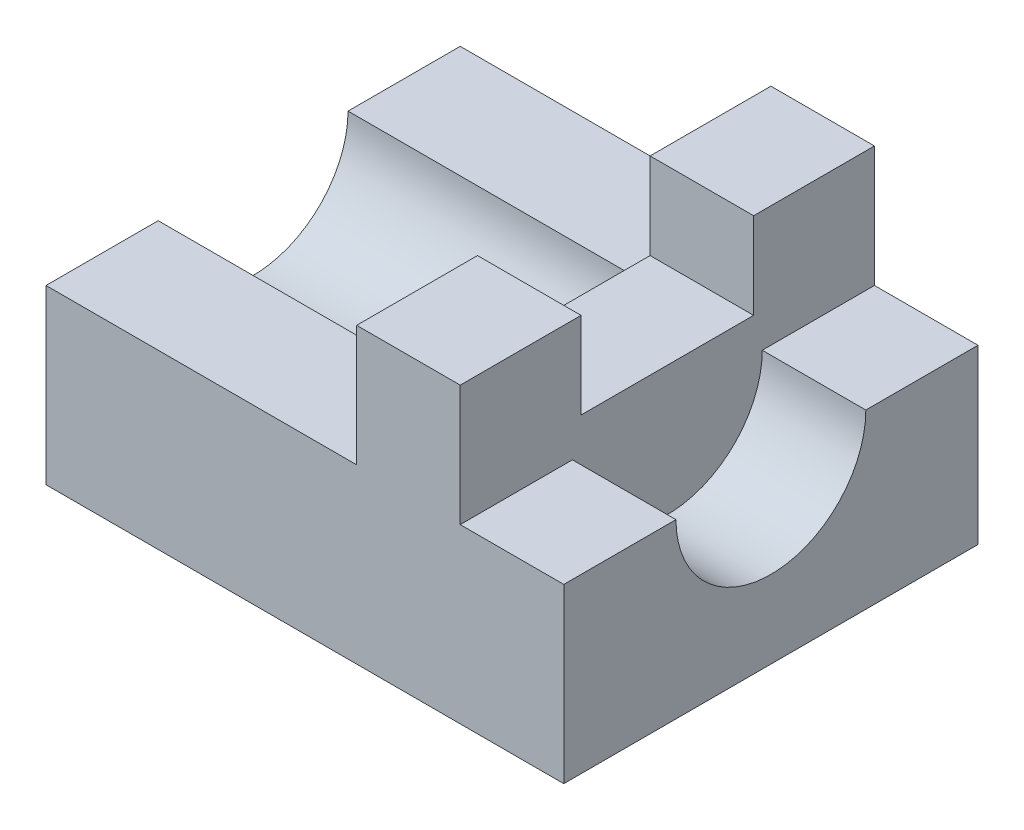
ISO-10303-21;
HEADER;
FILE_DESCRIPTION(('STEP AP214'),'2;1');
FILE_NAME('part.step','',(''),(''),'','','');
FILE_SCHEMA(('AUTOMOTIVE_DESIGN { 1 0 10303 214 1 1 1 1 }'));
ENDSEC;
DATA;
#1=APPLICATION_CONTEXT('core data for automotive mechanical design processes');
#2=APPLICATION_PROTOCOL_DEFINITION('international standard','automotive_design',2000,#1);
#3=PRODUCT_CONTEXT('',#1,'mechanical');
#4=PRODUCT('Part','Part','',(#3));
#5=PRODUCT_RELATED_PRODUCT_CATEGORY('part','',(#4));
#6=PRODUCT_DEFINITION_FORMATION('','',#4);
#7=PRODUCT_DEFINITION_CONTEXT('part definition',#1,'design');
#8=PRODUCT_DEFINITION('design','',#6,#7);
#9=PRODUCT_DEFINITION_SHAPE('','',#8);
#10=(LENGTH_UNIT() NAMED_UNIT(*) SI_UNIT(.MILLI.,.METRE.));
#11=(NAMED_UNIT(*) PLANE_ANGLE_UNIT() SI_UNIT($,.RADIAN.));
#12=(NAMED_UNIT(*) SI_UNIT($,.STERADIAN.) SOLID_ANGLE_UNIT());
#13=UNCERTAINTY_MEASURE_WITH_UNIT(LENGTH_MEASURE(1.E-05),#10,'distance_accuracy_value','');
#14=(GEOMETRIC_REPRESENTATION_CONTEXT(3) GLOBAL_UNCERTAINTY_ASSIGNED_CONTEXT((#13)) GLOBAL_UNIT_ASSIGNED_CONTEXT((#10,
#11,#12)) REPRESENTATION_CONTEXT('',''));
#15=CARTESIAN_POINT('',(0.,0.,0.));
#16=DIRECTION('',(0.,0.,1.));
#17=DIRECTION('',(1.,0.,0.));
#18=AXIS2_PLACEMENT_3D('',#15,#16,#17);
#19=CARTESIAN_POINT('',(75.,25.,0.));
#20=DIRECTION('',(-1.,0.,0.));
#21=DIRECTION('',(0.,0.,1.));
#22=AXIS2_PLACEMENT_3D('',#19,#20,#21);
#23=CYLINDRICAL_SURFACE('',#22,27.5);
#24=DIRECTION('',(-1.,0.,0.));
#25=VECTOR('',#24,1.);
#26=CARTESIAN_POINT('',(75.,25.,27.5));
#27=LINE('',#26,#25);
#28=CARTESIAN_POINT('',(15.,25.,27.5));
#29=VERTEX_POINT('',#28);
#30=CARTESIAN_POINT('',(-75.,25.,27.5));
#31=VERTEX_POINT('',#30);
#32=EDGE_CURVE('E262',#29,#31,#27,.T.);
#33=ORIENTED_EDGE('',*,*,#32,.F.);
#34=CARTESIAN_POINT('',(15.,25.,0.));
#35=DIRECTION('',(1.,0.,0.));
#36=DIRECTION('',(0.,0.,-1.));
#37=AXIS2_PLACEMENT_3D('',#34,#35,#36);
#38=CIRCLE('',#37,27.5);
#39=CARTESIAN_POINT('',(15.,25.,-27.5));
#40=VERTEX_POINT('',#39);
#41=EDGE_CURVE('E215',#29,#40,#38,.T.);
#42=ORIENTED_EDGE('',*,*,#41,.T.);
#43=DIRECTION('',(-1.,0.,0.));
#44=VECTOR('',#43,1.);
#45=CARTESIAN_POINT('',(75.,25.,-27.5));
#46=LINE('',#45,#44);
#47=CARTESIAN_POINT('',(-75.,25.,-27.5));
#48=VERTEX_POINT('',#47);
#49=EDGE_CURVE('E251',#40,#48,#46,.T.);
#50=ORIENTED_EDGE('',*,*,#49,.T.);
#51=CARTESIAN_POINT('',(-75.,25.,0.));
#52=DIRECTION('',(1.,0.,0.));
#53=DIRECTION('',(0.,0.,-1.));
#54=AXIS2_PLACEMENT_3D('',#51,#52,#53);
#55=CIRCLE('',#54,27.5);
#56=EDGE_CURVE('E218',#31,#48,#55,.T.);
#57=ORIENTED_EDGE('',*,*,#56,.F.);
#58=EDGE_LOOP('',(#33,#42,#50,#57));
#59=FACE_BOUND('',#58,.T.);
#60=ADVANCED_FACE('F37',(#59),#23,.F.);
#61=CARTESIAN_POINT('',(75.,25.,0.));
#62=DIRECTION('',(0.,1.,0.));
#63=DIRECTION('',(0.,0.,1.));
#64=AXIS2_PLACEMENT_3D('',#61,#62,#63);
#65=PLANE('',#64);
#66=DIRECTION('',(-1.,0.,0.));
#67=VECTOR('',#66,1.);
#68=CARTESIAN_POINT('',(75.,25.,60.));
#69=LINE('',#68,#67);
#70=CARTESIAN_POINT('',(15.,25.,60.));
#71=VERTEX_POINT('',#70);
#72=CARTESIAN_POINT('',(-75.,25.,60.));
#73=VERTEX_POINT('',#72);
#74=EDGE_CURVE('E258',#71,#73,#69,.T.);
#75=ORIENTED_EDGE('',*,*,#74,.F.);
#76=DIRECTION('',(0.,0.,-1.));
#77=VECTOR('',#76,1.);
#78=CARTESIAN_POINT('',(15.,25.,0.));
#79=LINE('',#78,#77);
#80=EDGE_CURVE('E52',#71,#29,#79,.T.);
#81=ORIENTED_EDGE('',*,*,#80,.T.);
#82=ORIENTED_EDGE('',*,*,#32,.T.);
#83=DIRECTION('',(0.,0.,-1.));
#84=VECTOR('',#83,1.);
#85=CARTESIAN_POINT('',(-75.,25.,0.));
#86=LINE('',#85,#84);
#87=EDGE_CURVE('E236',#73,#31,#86,.T.);
#88=ORIENTED_EDGE('',*,*,#87,.F.);
#89=EDGE_LOOP('',(#75,#81,#82,#88));
#90=FACE_BOUND('',#89,.T.);
#91=ADVANCED_FACE('F318',(#90),#65,.T.);
#92=ORIENTED_EDGE('',*,*,#49,.F.);
#93=DIRECTION('',(0.,0.,-1.));
#94=VECTOR('',#93,1.);
#95=CARTESIAN_POINT('',(15.,25.,0.));
#96=LINE('',#95,#94);
#97=CARTESIAN_POINT('',(15.,25.,-60.));
#98=VERTEX_POINT('',#97);
#99=EDGE_CURVE('E11',#40,#98,#96,.T.);
#100=ORIENTED_EDGE('',*,*,#99,.T.);
#101=DIRECTION('',(-1.,0.,0.));
#102=VECTOR('',#101,1.);
#103=CARTESIAN_POINT('',(75.,25.,-60.));
#104=LINE('',#103,#102);
#105=CARTESIAN_POINT('',(-75.,25.,-60.));
#106=VERTEX_POINT('',#105);
#107=EDGE_CURVE('E250',#98,#106,#104,.T.);
#108=ORIENTED_EDGE('',*,*,#107,.T.);
#109=EDGE_CURVE('E223',#48,#106,#86,.T.);
#110=ORIENTED_EDGE('',*,*,#109,.F.);
#111=EDGE_LOOP('',(#92,#100,#108,#110));
#112=FACE_BOUND('',#111,.T.);
#113=ADVANCED_FACE('F312',(#112),#65,.T.);
#114=CARTESIAN_POINT('',(45.,25.,0.));
#115=DIRECTION('',(1.,0.,0.));
#116=DIRECTION('',(0.,0.,-1.));
#117=AXIS2_PLACEMENT_3D('',#114,#115,#116);
#118=CIRCLE('',#117,27.5);
#119=CARTESIAN_POINT('',(45.,25.,27.5));
#120=VERTEX_POINT('',#119);
#121=CARTESIAN_POINT('',(45.,25.,-27.5));
#122=VERTEX_POINT('',#121);
#123=EDGE_CURVE('E60',#120,#122,#118,.T.);
#124=ORIENTED_EDGE('',*,*,#123,.F.);
#125=CARTESIAN_POINT('',(75.,25.,27.5));
#126=VERTEX_POINT('',#125);
#127=EDGE_CURVE('E263',#126,#120,#27,.T.);
#128=ORIENTED_EDGE('',*,*,#127,.F.);
#129=CARTESIAN_POINT('',(75.,25.,0.));
#130=DIRECTION('',(1.,0.,0.));
#131=DIRECTION('',(0.,0.,-1.));
#132=AXIS2_PLACEMENT_3D('',#129,#130,#131);
#133=CIRCLE('',#132,27.5);
#134=CARTESIAN_POINT('',(75.,25.,-27.5));
#135=VERTEX_POINT('',#134);
#136=EDGE_CURVE('E219',#126,#135,#133,.T.);
#137=ORIENTED_EDGE('',*,*,#136,.T.);
#138=EDGE_CURVE('E248',#135,#122,#46,.T.);
#139=ORIENTED_EDGE('',*,*,#138,.T.);
#140=EDGE_LOOP('',(#124,#128,#137,#139));
#141=FACE_BOUND('',#140,.T.);
#142=ADVANCED_FACE('F39',(#141),#23,.F.);
#143=DIRECTION('',(0.,0.,-1.));
#144=VECTOR('',#143,1.);
#145=CARTESIAN_POINT('',(45.,25.,0.));
#146=LINE('',#145,#144);
#147=CARTESIAN_POINT('',(45.,25.,60.));
#148=VERTEX_POINT('',#147);
#149=EDGE_CURVE('E212',#148,#120,#146,.T.);
#150=ORIENTED_EDGE('',*,*,#149,.F.);
#151=CARTESIAN_POINT('',(75.,25.,60.));
#152=VERTEX_POINT('',#151);
#153=EDGE_CURVE('E259',#152,#148,#69,.T.);
#154=ORIENTED_EDGE('',*,*,#153,.F.);
#155=DIRECTION('',(0.,0.,-1.));
#156=VECTOR('',#155,1.);
#157=CARTESIAN_POINT('',(75.,25.,0.));
#158=LINE('',#157,#156);
#159=EDGE_CURVE('E222',#152,#126,#158,.T.);
#160=ORIENTED_EDGE('',*,*,#159,.T.);
#161=ORIENTED_EDGE('',*,*,#127,.T.);
#162=EDGE_LOOP('',(#150,#154,#160,#161));
#163=FACE_BOUND('',#162,.T.);
#164=ADVANCED_FACE('F294',(#163),#65,.T.);
#165=CARTESIAN_POINT('',(75.,0.,60.));
#166=DIRECTION('',(0.,0.,1.));
#167=DIRECTION('',(1.,0.,0.));
#168=AXIS2_PLACEMENT_3D('',#165,#166,#167);
#169=PLANE('',#168);
#170=ORIENTED_EDGE('',*,*,#153,.T.);
#171=DIRECTION('',(0.,1.,0.));
#172=VECTOR('',#171,1.);
#173=CARTESIAN_POINT('',(45.,0.,60.));
#174=LINE('',#173,#172);
#175=CARTESIAN_POINT('',(45.,60.,60.));
#176=VERTEX_POINT('',#175);
#177=EDGE_CURVE('E198',#148,#176,#174,.T.);
#178=ORIENTED_EDGE('',*,*,#177,.T.);
#179=DIRECTION('',(1.,0.,0.));
#180=VECTOR('',#179,1.);
#181=CARTESIAN_POINT('',(15.,60.,60.));
#182=LINE('',#181,#180);
#183=CARTESIAN_POINT('',(15.,60.,60.));
#184=VERTEX_POINT('',#183);
#185=EDGE_CURVE('E205',#184,#176,#182,.T.);
#186=ORIENTED_EDGE('',*,*,#185,.F.);
#187=DIRECTION('',(0.,1.,0.));
#188=VECTOR('',#187,1.);
#189=CARTESIAN_POINT('',(15.,0.,60.));
#190=LINE('',#189,#188);
#191=EDGE_CURVE('E187',#71,#184,#190,.T.);
#192=ORIENTED_EDGE('',*,*,#191,.F.);
#193=ORIENTED_EDGE('',*,*,#74,.T.);
#194=DIRECTION('',(0.,1.,0.));
#195=VECTOR('',#194,1.);
#196=CARTESIAN_POINT('',(-75.,0.,60.));
#197=LINE('',#196,#195);
#198=CARTESIAN_POINT('',(-75.,-25.,60.));
#199=VERTEX_POINT('',#198);
#200=EDGE_CURVE('E239',#199,#73,#197,.T.);
#201=ORIENTED_EDGE('',*,*,#200,.F.);
#202=DIRECTION('',(-1.,0.,0.));
#203=VECTOR('',#202,1.);
#204=CARTESIAN_POINT('',(75.,-25.,60.));
#205=LINE('',#204,#203);
#206=CARTESIAN_POINT('',(75.,-25.,60.));
#207=VERTEX_POINT('',#206);
#208=EDGE_CURVE('E256',#207,#199,#205,.T.);
#209=ORIENTED_EDGE('',*,*,#208,.F.);
#210=DIRECTION('',(0.,1.,0.));
#211=VECTOR('',#210,1.);
#212=CARTESIAN_POINT('',(75.,0.,60.));
#213=LINE('',#212,#211);
#214=EDGE_CURVE('E226',#207,#152,#213,.T.);
#215=ORIENTED_EDGE('',*,*,#214,.T.);
#216=EDGE_LOOP('',(#170,#178,#186,#192,#193,#201,#209,#215));
#217=FACE_BOUND('',#216,.T.);
#218=ADVANCED_FACE('F289',(#217),#169,.T.);
#219=CARTESIAN_POINT('',(75.,-25.,0.));
#220=DIRECTION('',(0.,1.,0.));
#221=DIRECTION('',(0.,0.,1.));
#222=AXIS2_PLACEMENT_3D('',#219,#220,#221);
#223=PLANE('',#222);
#224=ORIENTED_EDGE('',*,*,#208,.T.);
#225=DIRECTION('',(0.,0.,-1.));
#226=VECTOR('',#225,1.);
#227=CARTESIAN_POINT('',(-75.,-25.,0.));
#228=LINE('',#227,#226);
#229=CARTESIAN_POINT('',(-75.,-25.,-60.));
#230=VERTEX_POINT('',#229);
#231=EDGE_CURVE('E242',#199,#230,#228,.T.);
#232=ORIENTED_EDGE('',*,*,#231,.T.);
#233=DIRECTION('',(-1.,0.,0.));
#234=VECTOR('',#233,1.);
#235=CARTESIAN_POINT('',(75.,-25.,-60.));
#236=LINE('',#235,#234);
#237=CARTESIAN_POINT('',(75.,-25.,-60.));
#238=VERTEX_POINT('',#237);
#239=EDGE_CURVE('E254',#238,#230,#236,.T.);
#240=ORIENTED_EDGE('',*,*,#239,.F.);
#241=DIRECTION('',(0.,0.,-1.));
#242=VECTOR('',#241,1.);
#243=CARTESIAN_POINT('',(75.,-25.,0.));
#244=LINE('',#243,#242);
#245=EDGE_CURVE('E230',#207,#238,#244,.T.);
#246=ORIENTED_EDGE('',*,*,#245,.F.);
#247=EDGE_LOOP('',(#224,#232,#240,#246));
#248=FACE_BOUND('',#247,.T.);
#249=ADVANCED_FACE('F333',(#248),#223,.F.);
#250=CARTESIAN_POINT('',(75.,0.,-60.));
#251=DIRECTION('',(0.,0.,1.));
#252=DIRECTION('',(1.,0.,0.));
#253=AXIS2_PLACEMENT_3D('',#250,#251,#252);
#254=PLANE('',#253);
#255=ORIENTED_EDGE('',*,*,#239,.T.);
#256=DIRECTION('',(0.,1.,0.));
#257=VECTOR('',#256,1.);
#258=CARTESIAN_POINT('',(-75.,0.,-60.));
#259=LINE('',#258,#257);
#260=EDGE_CURVE('E245',#230,#106,#259,.T.);
#261=ORIENTED_EDGE('',*,*,#260,.T.);
#262=ORIENTED_EDGE('',*,*,#107,.F.);
#263=DIRECTION('',(0.,1.,0.));
#264=VECTOR('',#263,1.);
#265=CARTESIAN_POINT('',(15.,0.,-60.));
#266=LINE('',#265,#264);
#267=CARTESIAN_POINT('',(15.,60.,-60.));
#268=VERTEX_POINT('',#267);
#269=EDGE_CURVE('E189',#98,#268,#266,.T.);
#270=ORIENTED_EDGE('',*,*,#269,.T.);
#271=DIRECTION('',(1.,0.,0.));
#272=VECTOR('',#271,1.);
#273=CARTESIAN_POINT('',(15.,60.,-60.));
#274=LINE('',#273,#272);
#275=CARTESIAN_POINT('',(45.,60.,-60.));
#276=VERTEX_POINT('',#275);
#277=EDGE_CURVE('E202',#268,#276,#274,.T.);
#278=ORIENTED_EDGE('',*,*,#277,.T.);
#279=DIRECTION('',(0.,1.,0.));
#280=VECTOR('',#279,1.);
#281=CARTESIAN_POINT('',(45.,0.,-60.));
#282=LINE('',#281,#280);
#283=CARTESIAN_POINT('',(45.,25.,-60.));
#284=VERTEX_POINT('',#283);
#285=EDGE_CURVE('E179',#284,#276,#282,.T.);
#286=ORIENTED_EDGE('',*,*,#285,.F.);
#287=CARTESIAN_POINT('',(75.,25.,-60.));
#288=VERTEX_POINT('',#287);
#289=EDGE_CURVE('E252',#288,#284,#104,.T.);
#290=ORIENTED_EDGE('',*,*,#289,.F.);
#291=DIRECTION('',(0.,1.,0.));
#292=VECTOR('',#291,1.);
#293=CARTESIAN_POINT('',(75.,0.,-60.));
#294=LINE('',#293,#292);
#295=EDGE_CURVE('E232',#238,#288,#294,.T.);
#296=ORIENTED_EDGE('',*,*,#295,.F.);
#297=EDGE_LOOP('',(#255,#261,#262,#270,#278,#286,#290,#296));
#298=FACE_BOUND('',#297,.T.);
#299=ADVANCED_FACE('F272',(#298),#254,.F.);
#300=DIRECTION('',(0.,0.,-1.));
#301=VECTOR('',#300,1.);
#302=CARTESIAN_POINT('',(45.,25.,0.));
#303=LINE('',#302,#301);
#304=EDGE_CURVE('E45',#122,#284,#303,.T.);
#305=ORIENTED_EDGE('',*,*,#304,.F.);
#306=ORIENTED_EDGE('',*,*,#138,.F.);
#307=EDGE_CURVE('E227',#135,#288,#158,.T.);
#308=ORIENTED_EDGE('',*,*,#307,.T.);
#309=ORIENTED_EDGE('',*,*,#289,.T.);
#310=EDGE_LOOP('',(#305,#306,#308,#309));
#311=FACE_BOUND('',#310,.T.);
#312=ADVANCED_FACE('F299',(#311),#65,.T.);
#313=CARTESIAN_POINT('',(75.,0.,0.));
#314=DIRECTION('',(1.,0.,0.));
#315=DIRECTION('',(0.,0.,-1.));
#316=AXIS2_PLACEMENT_3D('',#313,#314,#315);
#317=PLANE('',#316);
#318=ORIENTED_EDGE('',*,*,#136,.F.);
#319=ORIENTED_EDGE('',*,*,#159,.F.);
#320=ORIENTED_EDGE('',*,*,#214,.F.);
#321=ORIENTED_EDGE('',*,*,#245,.T.);
#322=ORIENTED_EDGE('',*,*,#295,.T.);
#323=ORIENTED_EDGE('',*,*,#307,.F.);
#324=EDGE_LOOP('',(#318,#319,#320,#321,#322,#323));
#325=FACE_BOUND('',#324,.T.);
#326=ADVANCED_FACE('F297',(#325),#317,.T.);
#327=CARTESIAN_POINT('',(-75.,0.,0.));
#328=DIRECTION('',(1.,0.,0.));
#329=DIRECTION('',(0.,0.,-1.));
#330=AXIS2_PLACEMENT_3D('',#327,#328,#329);
#331=PLANE('',#330);
#332=ORIENTED_EDGE('',*,*,#56,.T.);
#333=ORIENTED_EDGE('',*,*,#109,.T.);
#334=ORIENTED_EDGE('',*,*,#260,.F.);
#335=ORIENTED_EDGE('',*,*,#231,.F.);
#336=ORIENTED_EDGE('',*,*,#200,.T.);
#337=ORIENTED_EDGE('',*,*,#87,.T.);
#338=EDGE_LOOP('',(#332,#333,#334,#335,#336,#337));
#339=FACE_BOUND('',#338,.T.);
#340=ADVANCED_FACE('F309',(#339),#331,.F.);
#341=CARTESIAN_POINT('',(15.,0.,-25.));
#342=DIRECTION('',(0.,0.,-1.));
#343=DIRECTION('',(0.,1.,0.));
#344=AXIS2_PLACEMENT_3D('',#341,#342,#343);
#345=PLANE('',#344);
#346=DIRECTION('',(0.,1.,0.));
#347=VECTOR('',#346,1.);
#348=CARTESIAN_POINT('',(45.,0.,-25.));
#349=LINE('',#348,#347);
#350=CARTESIAN_POINT('',(45.,35.,-25.));
#351=VERTEX_POINT('',#350);
#352=CARTESIAN_POINT('',(45.,60.,-25.));
#353=VERTEX_POINT('',#352);
#354=EDGE_CURVE('E191',#351,#353,#349,.T.);
#355=ORIENTED_EDGE('',*,*,#354,.T.);
#356=DIRECTION('',(1.,0.,0.));
#357=VECTOR('',#356,1.);
#358=CARTESIAN_POINT('',(15.,60.,-25.));
#359=LINE('',#358,#357);
#360=CARTESIAN_POINT('',(15.,60.,-25.));
#361=VERTEX_POINT('',#360);
#362=EDGE_CURVE('E174',#361,#353,#359,.T.);
#363=ORIENTED_EDGE('',*,*,#362,.F.);
#364=DIRECTION('',(0.,1.,0.));
#365=VECTOR('',#364,1.);
#366=CARTESIAN_POINT('',(15.,0.,-25.));
#367=LINE('',#366,#365);
#368=CARTESIAN_POINT('',(15.,35.,-25.));
#369=VERTEX_POINT('',#368);
#370=EDGE_CURVE('E155',#369,#361,#367,.T.);
#371=ORIENTED_EDGE('',*,*,#370,.F.);
#372=DIRECTION('',(1.,0.,0.));
#373=VECTOR('',#372,1.);
#374=CARTESIAN_POINT('',(15.,35.,-25.));
#375=LINE('',#374,#373);
#376=EDGE_CURVE('E163',#369,#351,#375,.T.);
#377=ORIENTED_EDGE('',*,*,#376,.T.);
#378=EDGE_LOOP('',(#355,#363,#371,#377));
#379=FACE_BOUND('',#378,.T.);
#380=ADVANCED_FACE('F173',(#379),#345,.F.);
#381=CARTESIAN_POINT('',(15.,60.,0.));
#382=DIRECTION('',(0.,1.,0.));
#383=DIRECTION('',(0.,0.,1.));
#384=AXIS2_PLACEMENT_3D('',#381,#382,#383);
#385=PLANE('',#384);
#386=DIRECTION('',(0.,0.,1.));
#387=VECTOR('',#386,1.);
#388=CARTESIAN_POINT('',(45.,60.,0.));
#389=LINE('',#388,#387);
#390=EDGE_CURVE('E176',#276,#353,#389,.T.);
#391=ORIENTED_EDGE('',*,*,#390,.F.);
#392=ORIENTED_EDGE('',*,*,#277,.F.);
#393=DIRECTION('',(0.,0.,1.));
#394=VECTOR('',#393,1.);
#395=CARTESIAN_POINT('',(15.,60.,0.));
#396=LINE('',#395,#394);
#397=EDGE_CURVE('E171',#268,#361,#396,.T.);
#398=ORIENTED_EDGE('',*,*,#397,.T.);
#399=ORIENTED_EDGE('',*,*,#362,.T.);
#400=EDGE_LOOP('',(#391,#392,#398,#399));
#401=FACE_BOUND('',#400,.T.);
#402=ADVANCED_FACE('F280',(#401),#385,.T.);
#403=CARTESIAN_POINT('',(45.,60.,25.));
#404=VERTEX_POINT('',#403);
#405=EDGE_CURVE('E181',#404,#176,#389,.T.);
#406=ORIENTED_EDGE('',*,*,#405,.F.);
#407=DIRECTION('',(1.,0.,0.));
#408=VECTOR('',#407,1.);
#409=CARTESIAN_POINT('',(15.,60.,25.));
#410=LINE('',#409,#408);
#411=CARTESIAN_POINT('',(15.,60.,25.));
#412=VERTEX_POINT('',#411);
#413=EDGE_CURVE('E208',#412,#404,#410,.T.);
#414=ORIENTED_EDGE('',*,*,#413,.F.);
#415=EDGE_CURVE('E184',#412,#184,#396,.T.);
#416=ORIENTED_EDGE('',*,*,#415,.T.);
#417=ORIENTED_EDGE('',*,*,#185,.T.);
#418=EDGE_LOOP('',(#406,#414,#416,#417));
#419=FACE_BOUND('',#418,.T.);
#420=ADVANCED_FACE('F286',(#419),#385,.T.);
#421=CARTESIAN_POINT('',(15.,0.,25.));
#422=DIRECTION('',(0.,0.,-1.));
#423=DIRECTION('',(0.,1.,0.));
#424=AXIS2_PLACEMENT_3D('',#421,#422,#423);
#425=PLANE('',#424);
#426=DIRECTION('',(0.,1.,0.));
#427=VECTOR('',#426,1.);
#428=CARTESIAN_POINT('',(45.,0.,25.));
#429=LINE('',#428,#427);
#430=CARTESIAN_POINT('',(45.,35.,25.));
#431=VERTEX_POINT('',#430);
#432=EDGE_CURVE('E194',#431,#404,#429,.T.);
#433=ORIENTED_EDGE('',*,*,#432,.F.);
#434=DIRECTION('',(1.,0.,0.));
#435=VECTOR('',#434,1.);
#436=CARTESIAN_POINT('',(15.,35.,25.));
#437=LINE('',#436,#435);
#438=CARTESIAN_POINT('',(15.,35.,25.));
#439=VERTEX_POINT('',#438);
#440=EDGE_CURVE('E170',#439,#431,#437,.T.);
#441=ORIENTED_EDGE('',*,*,#440,.F.);
#442=DIRECTION('',(0.,1.,0.));
#443=VECTOR('',#442,1.);
#444=CARTESIAN_POINT('',(15.,0.,25.));
#445=LINE('',#444,#443);
#446=EDGE_CURVE('E159',#439,#412,#445,.T.);
#447=ORIENTED_EDGE('',*,*,#446,.T.);
#448=ORIENTED_EDGE('',*,*,#413,.T.);
#449=EDGE_LOOP('',(#433,#441,#447,#448));
#450=FACE_BOUND('',#449,.T.);
#451=ADVANCED_FACE('F283',(#450),#425,.T.);
#452=CARTESIAN_POINT('',(15.,35.,0.));
#453=DIRECTION('',(0.,-1.,0.));
#454=DIRECTION('',(0.,0.,-1.));
#455=AXIS2_PLACEMENT_3D('',#452,#453,#454);
#456=PLANE('',#455);
#457=DIRECTION('',(0.,0.,-1.));
#458=VECTOR('',#457,1.);
#459=CARTESIAN_POINT('',(45.,35.,0.));
#460=LINE('',#459,#458);
#461=EDGE_CURVE('E166',#431,#351,#460,.T.);
#462=ORIENTED_EDGE('',*,*,#461,.T.);
#463=ORIENTED_EDGE('',*,*,#376,.F.);
#464=DIRECTION('',(0.,0.,-1.));
#465=VECTOR('',#464,1.);
#466=CARTESIAN_POINT('',(15.,35.,0.));
#467=LINE('',#466,#465);
#468=EDGE_CURVE('E150',#439,#369,#467,.T.);
#469=ORIENTED_EDGE('',*,*,#468,.F.);
#470=ORIENTED_EDGE('',*,*,#440,.T.);
#471=EDGE_LOOP('',(#462,#463,#469,#470));
#472=FACE_BOUND('',#471,.T.);
#473=ADVANCED_FACE('F164',(#472),#456,.F.);
#474=CARTESIAN_POINT('',(15.,0.,0.));
#475=DIRECTION('',(1.,0.,0.));
#476=DIRECTION('',(0.,0.,-1.));
#477=AXIS2_PLACEMENT_3D('',#474,#475,#476);
#478=PLANE('',#477);
#479=ORIENTED_EDGE('',*,*,#80,.F.);
#480=ORIENTED_EDGE('',*,*,#191,.T.);
#481=ORIENTED_EDGE('',*,*,#415,.F.);
#482=ORIENTED_EDGE('',*,*,#446,.F.);
#483=ORIENTED_EDGE('',*,*,#468,.T.);
#484=ORIENTED_EDGE('',*,*,#370,.T.);
#485=ORIENTED_EDGE('',*,*,#397,.F.);
#486=ORIENTED_EDGE('',*,*,#269,.F.);
#487=ORIENTED_EDGE('',*,*,#99,.F.);
#488=ORIENTED_EDGE('',*,*,#41,.F.);
#489=EDGE_LOOP('',(#479,#480,#481,#482,#483,#484,#485,#486,#487,#488));
#490=FACE_BOUND('',#489,.T.);
#491=ADVANCED_FACE('F152',(#490),#478,.F.);
#492=CARTESIAN_POINT('',(45.,0.,0.));
#493=DIRECTION('',(1.,0.,0.));
#494=DIRECTION('',(0.,0.,-1.));
#495=AXIS2_PLACEMENT_3D('',#492,#493,#494);
#496=PLANE('',#495);
#497=ORIENTED_EDGE('',*,*,#177,.F.);
#498=ORIENTED_EDGE('',*,*,#149,.T.);
#499=ORIENTED_EDGE('',*,*,#123,.T.);
#500=ORIENTED_EDGE('',*,*,#304,.T.);
#501=ORIENTED_EDGE('',*,*,#285,.T.);
#502=ORIENTED_EDGE('',*,*,#390,.T.);
#503=ORIENTED_EDGE('',*,*,#354,.F.);
#504=ORIENTED_EDGE('',*,*,#461,.F.);
#505=ORIENTED_EDGE('',*,*,#432,.T.);
#506=ORIENTED_EDGE('',*,*,#405,.T.);
#507=EDGE_LOOP('',(#497,#498,#499,#500,#501,#502,#503,#504,#505,#506));
#508=FACE_BOUND('',#507,.T.);
#509=ADVANCED_FACE('F268',(#508),#496,.T.);
#510=CLOSED_SHELL('',(#60,#91,#113,#142,#164,#218,#249,#299,#312,#326,#340,#380,#402,#420,#451,
#473,#491,#509));
#511=MANIFOLD_SOLID_BREP('B2',#510);
#512=ADVANCED_BREP_SHAPE_REPRESENTATION('',(#18,#511),#14);
#513=SHAPE_DEFINITION_REPRESENTATION(#9,#512);
ENDSEC;
END-ISO-10303-21;
